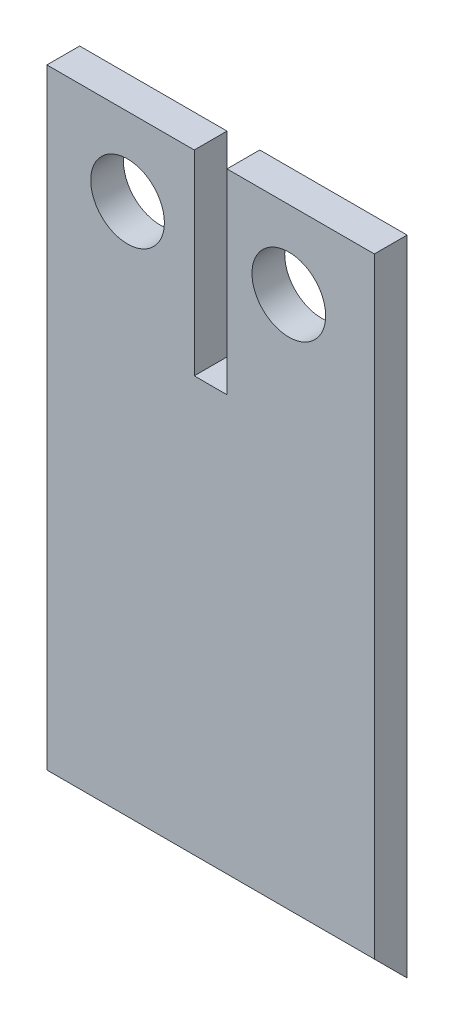
ISO-10303-21;
HEADER;
FILE_DESCRIPTION(('STEP AP214'),'2;1');
FILE_NAME('part.step','',(''),(''),'','','');
FILE_SCHEMA(('AUTOMOTIVE_DESIGN { 1 0 10303 214 1 1 1 1 }'));
ENDSEC;
DATA;
#1=APPLICATION_CONTEXT('core data for automotive mechanical design processes');
#2=APPLICATION_PROTOCOL_DEFINITION('international standard','automotive_design',2000,#1);
#3=PRODUCT_CONTEXT('',#1,'mechanical');
#4=PRODUCT('Part','Part','',(#3));
#5=PRODUCT_RELATED_PRODUCT_CATEGORY('part','',(#4));
#6=PRODUCT_DEFINITION_FORMATION('','',#4);
#7=PRODUCT_DEFINITION_CONTEXT('part definition',#1,'design');
#8=PRODUCT_DEFINITION('design','',#6,#7);
#9=PRODUCT_DEFINITION_SHAPE('','',#8);
#10=(LENGTH_UNIT() NAMED_UNIT(*) SI_UNIT(.MILLI.,.METRE.));
#11=(NAMED_UNIT(*) PLANE_ANGLE_UNIT() SI_UNIT($,.RADIAN.));
#12=(NAMED_UNIT(*) SI_UNIT($,.STERADIAN.) SOLID_ANGLE_UNIT());
#13=UNCERTAINTY_MEASURE_WITH_UNIT(LENGTH_MEASURE(1.E-05),#10,'distance_accuracy_value','');
#14=(GEOMETRIC_REPRESENTATION_CONTEXT(3) GLOBAL_UNCERTAINTY_ASSIGNED_CONTEXT((#13)) GLOBAL_UNIT_ASSIGNED_CONTEXT((#10,
#11,#12)) REPRESENTATION_CONTEXT('',''));
#15=CARTESIAN_POINT('',(0.,0.,0.));
#16=DIRECTION('',(0.,0.,1.));
#17=DIRECTION('',(1.,0.,0.));
#18=AXIS2_PLACEMENT_3D('',#15,#16,#17);
#19=CARTESIAN_POINT('',(1.27451486335826,14.9609502895532,-6.34261418809615));
#20=DIRECTION('',(-1.,0.,0.));
#21=DIRECTION('',(0.,1.,0.));
#22=AXIS2_PLACEMENT_3D('',#19,#20,#21);
#23=PLANE('',#22);
#24=DIRECTION('',(0.,1.,0.));
#25=VECTOR('',#24,1.);
#26=CARTESIAN_POINT('',(1.27451486335826,-90.3427287619298,1.65738581190384));
#27=LINE('',#26,#25);
#28=CARTESIAN_POINT('',(1.27451486335826,3.01245651019011,1.65738581190384));
#29=VERTEX_POINT('',#28);
#30=CARTESIAN_POINT('',(1.27451486335826,14.9609502895532,1.65738581190384));
#31=VERTEX_POINT('',#30);
#32=EDGE_CURVE('E158',#29,#31,#27,.T.);
#33=ORIENTED_EDGE('',*,*,#32,.T.);
#34=DIRECTION('',(0.,0.,1.));
#35=VECTOR('',#34,1.);
#36=CARTESIAN_POINT('',(1.27451486335826,14.9609502895532,-2.44261418809614));
#37=LINE('',#36,#35);
#38=CARTESIAN_POINT('',(1.27451486335826,14.9609502895532,3.65738581190385));
#39=VERTEX_POINT('',#38);
#40=EDGE_CURVE('E41',#31,#39,#37,.T.);
#41=ORIENTED_EDGE('',*,*,#40,.T.);
#42=DIRECTION('',(0.,-1.,0.));
#43=VECTOR('',#42,1.);
#44=CARTESIAN_POINT('',(1.27451486335826,14.9609502895532,3.65738581190385));
#45=LINE('',#44,#43);
#46=CARTESIAN_POINT('',(1.27451486335826,3.01245651019011,3.65738581190385));
#47=VERTEX_POINT('',#46);
#48=EDGE_CURVE('E178',#39,#47,#45,.T.);
#49=ORIENTED_EDGE('',*,*,#48,.T.);
#50=DIRECTION('',(0.,0.,1.));
#51=VECTOR('',#50,1.);
#52=CARTESIAN_POINT('',(1.27451486335826,3.01245651019011,-6.34261418809615));
#53=LINE('',#52,#51);
#54=EDGE_CURVE('E11',#29,#47,#53,.T.);
#55=ORIENTED_EDGE('',*,*,#54,.F.);
#56=EDGE_LOOP('',(#33,#41,#49,#55));
#57=FACE_BOUND('',#56,.T.);
#58=ADVANCED_FACE('F17',(#57),#23,.F.);
#59=CARTESIAN_POINT('',(3.27451486335826,3.01245651019011,-6.34261418809615));
#60=DIRECTION('',(0.,-1.,0.));
#61=DIRECTION('',(0.,0.,-1.));
#62=AXIS2_PLACEMENT_3D('',#59,#60,#61);
#63=PLANE('',#62);
#64=DIRECTION('',(-1.,0.,0.));
#65=VECTOR('',#64,1.);
#66=CARTESIAN_POINT('',(-7.72548513664177,3.01245651019011,1.65738581190384));
#67=LINE('',#66,#65);
#68=CARTESIAN_POINT('',(3.27451486335826,3.01245651019011,1.65738581190384));
#69=VERTEX_POINT('',#68);
#70=EDGE_CURVE('E161',#69,#29,#67,.T.);
#71=ORIENTED_EDGE('',*,*,#70,.T.);
#72=ORIENTED_EDGE('',*,*,#54,.T.);
#73=DIRECTION('',(1.,0.,0.));
#74=VECTOR('',#73,1.);
#75=CARTESIAN_POINT('',(3.27451486335826,3.01245651019011,3.65738581190385));
#76=LINE('',#75,#74);
#77=CARTESIAN_POINT('',(3.27451486335826,3.01245651019011,3.65738581190385));
#78=VERTEX_POINT('',#77);
#79=EDGE_CURVE('E174',#47,#78,#76,.T.);
#80=ORIENTED_EDGE('',*,*,#79,.T.);
#81=DIRECTION('',(0.,0.,1.));
#82=VECTOR('',#81,1.);
#83=CARTESIAN_POINT('',(3.27451486335826,3.01245651019011,-6.34261418809615));
#84=LINE('',#83,#82);
#85=EDGE_CURVE('E21',#69,#78,#84,.T.);
#86=ORIENTED_EDGE('',*,*,#85,.F.);
#87=EDGE_LOOP('',(#71,#72,#80,#86));
#88=FACE_BOUND('',#87,.T.);
#89=ADVANCED_FACE('F235',(#88),#63,.F.);
#90=CARTESIAN_POINT('',(3.27451486335826,14.9609502895532,-6.34261418809615));
#91=DIRECTION('',(1.,0.,0.));
#92=DIRECTION('',(0.,1.,0.));
#93=AXIS2_PLACEMENT_3D('',#90,#91,#92);
#94=PLANE('',#93);
#95=DIRECTION('',(0.,-1.,0.));
#96=VECTOR('',#95,1.);
#97=CARTESIAN_POINT('',(3.27451486335827,-90.3427287619298,1.65738581190384));
#98=LINE('',#97,#96);
#99=CARTESIAN_POINT('',(3.27451486335826,14.9609502895532,1.65738581190384));
#100=VERTEX_POINT('',#99);
#101=EDGE_CURVE('E128',#100,#69,#98,.T.);
#102=ORIENTED_EDGE('',*,*,#101,.T.);
#103=ORIENTED_EDGE('',*,*,#85,.T.);
#104=DIRECTION('',(0.,1.,0.));
#105=VECTOR('',#104,1.);
#106=CARTESIAN_POINT('',(3.27451486335826,14.9609502895532,3.65738581190385));
#107=LINE('',#106,#105);
#108=CARTESIAN_POINT('',(3.27451486335826,14.9609502895532,3.65738581190385));
#109=VERTEX_POINT('',#108);
#110=EDGE_CURVE('E171',#78,#109,#107,.T.);
#111=ORIENTED_EDGE('',*,*,#110,.T.);
#112=DIRECTION('',(0.,0.,-1.));
#113=VECTOR('',#112,1.);
#114=CARTESIAN_POINT('',(3.27451486335826,14.9609502895532,-2.44261418809614));
#115=LINE('',#114,#113);
#116=EDGE_CURVE('E208',#109,#100,#115,.T.);
#117=ORIENTED_EDGE('',*,*,#116,.T.);
#118=EDGE_LOOP('',(#102,#103,#111,#117));
#119=FACE_BOUND('',#118,.T.);
#120=ADVANCED_FACE('F244',(#119),#94,.F.);
#121=CARTESIAN_POINT('',(11.9745148633661,14.9609502895532,-2.44261418809614));
#122=DIRECTION('',(0.,1.,0.));
#123=DIRECTION('',(1.,0.,0.));
#124=AXIS2_PLACEMENT_3D('',#121,#122,#123);
#125=PLANE('',#124);
#126=ORIENTED_EDGE('',*,*,#40,.F.);
#127=DIRECTION('',(-1.,0.,0.));
#128=VECTOR('',#127,1.);
#129=CARTESIAN_POINT('',(12.2745148633584,14.9609502895532,1.65738581190384));
#130=LINE('',#129,#128);
#131=CARTESIAN_POINT('',(-7.72548513664175,14.9609502895531,1.65738581190384));
#132=VERTEX_POINT('',#131);
#133=EDGE_CURVE('E153',#31,#132,#130,.T.);
#134=ORIENTED_EDGE('',*,*,#133,.T.);
#135=DIRECTION('',(0.,0.,1.));
#136=VECTOR('',#135,1.);
#137=CARTESIAN_POINT('',(-7.72548513664175,14.9609502895531,3.65738581190385));
#138=LINE('',#137,#136);
#139=CARTESIAN_POINT('',(-7.72548513664175,14.9609502895532,3.65738581190385));
#140=VERTEX_POINT('',#139);
#141=EDGE_CURVE('E166',#132,#140,#138,.T.);
#142=ORIENTED_EDGE('',*,*,#141,.T.);
#143=DIRECTION('',(1.,0.,0.));
#144=VECTOR('',#143,1.);
#145=CARTESIAN_POINT('',(12.2745148633584,14.9609502895532,3.65738581190385));
#146=LINE('',#145,#144);
#147=EDGE_CURVE('E55',#140,#39,#146,.T.);
#148=ORIENTED_EDGE('',*,*,#147,.T.);
#149=EDGE_LOOP('',(#126,#134,#142,#148));
#150=FACE_BOUND('',#149,.T.);
#151=ADVANCED_FACE('F19',(#150),#125,.T.);
#152=CARTESIAN_POINT('',(-7.72548513664175,-90.3427287619298,3.65738581190385));
#153=DIRECTION('',(0.,0.,1.));
#154=DIRECTION('',(1.,0.,0.));
#155=AXIS2_PLACEMENT_3D('',#152,#153,#154);
#156=PLANE('',#155);
#157=CARTESIAN_POINT('',(-2.80048513663389,10.1998046715531,3.65738581190385));
#158=DIRECTION('',(0.,0.,1.));
#159=DIRECTION('',(1.,0.,0.));
#160=AXIS2_PLACEMENT_3D('',#157,#158,#159);
#161=CIRCLE('',#160,2.24999999996944);
#162=CARTESIAN_POINT('',(-0.55048513666445,10.1998046715531,3.65738581190385));
#163=VERTEX_POINT('',#162);
#164=EDGE_CURVE('E199',#163,#163,#161,.T.);
#165=ORIENTED_EDGE('',*,*,#164,.F.);
#166=EDGE_LOOP('',(#165));
#167=FACE_BOUND('',#166,.T.);
#168=CARTESIAN_POINT('',(7.04951486336611,10.1998046715532,3.65738581190385));
#169=DIRECTION('',(0.,0.,1.));
#170=DIRECTION('',(1.,0.,0.));
#171=AXIS2_PLACEMENT_3D('',#168,#169,#170);
#172=CIRCLE('',#171,2.24999999996944);
#173=CARTESIAN_POINT('',(9.29951486333555,10.1998046715532,3.65738581190385));
#174=VERTEX_POINT('',#173);
#175=EDGE_CURVE('E190',#174,#174,#172,.T.);
#176=ORIENTED_EDGE('',*,*,#175,.F.);
#177=EDGE_LOOP('',(#176));
#178=FACE_BOUND('',#177,.T.);
#179=ORIENTED_EDGE('',*,*,#110,.F.);
#180=ORIENTED_EDGE('',*,*,#79,.F.);
#181=ORIENTED_EDGE('',*,*,#48,.F.);
#182=ORIENTED_EDGE('',*,*,#147,.F.);
#183=DIRECTION('',(0.,1.,0.));
#184=VECTOR('',#183,1.);
#185=CARTESIAN_POINT('',(-7.72548513664175,-90.3427287619298,3.65738581190385));
#186=LINE('',#185,#184);
#187=CARTESIAN_POINT('',(-7.72548513664175,-22.3407287619297,3.65738581190385));
#188=VERTEX_POINT('',#187);
#189=EDGE_CURVE('E162',#188,#140,#186,.T.);
#190=ORIENTED_EDGE('',*,*,#189,.F.);
#191=DIRECTION('',(-1.,0.,0.));
#192=VECTOR('',#191,1.);
#193=CARTESIAN_POINT('',(-7.7254851366419,-22.3407287619298,3.65738581190385));
#194=LINE('',#193,#192);
#195=CARTESIAN_POINT('',(12.2745148633583,-22.3407287619297,3.65738581190385));
#196=VERTEX_POINT('',#195);
#197=EDGE_CURVE('E138',#196,#188,#194,.T.);
#198=ORIENTED_EDGE('',*,*,#197,.F.);
#199=DIRECTION('',(0.,1.,0.));
#200=VECTOR('',#199,1.);
#201=CARTESIAN_POINT('',(12.2745148633583,-90.3427287619298,3.65738581190385));
#202=LINE('',#201,#200);
#203=CARTESIAN_POINT('',(12.2745148633583,14.9609502895532,3.65738581190385));
#204=VERTEX_POINT('',#203);
#205=EDGE_CURVE('E133',#196,#204,#202,.T.);
#206=ORIENTED_EDGE('',*,*,#205,.T.);
#207=DIRECTION('',(1.,0.,0.));
#208=VECTOR('',#207,1.);
#209=CARTESIAN_POINT('',(12.2745148633584,14.9609502895532,3.65738581190385));
#210=LINE('',#209,#208);
#211=EDGE_CURVE('E212',#109,#204,#210,.T.);
#212=ORIENTED_EDGE('',*,*,#211,.F.);
#213=EDGE_LOOP('',(#179,#180,#181,#182,#190,#198,#206,#212));
#214=FACE_BOUND('',#213,.T.);
#215=ADVANCED_FACE('F248',(#167,#178,#214),#156,.T.);
#216=CARTESIAN_POINT('',(12.2745148633583,-90.3427287619298,3.65738581190385));
#217=DIRECTION('',(1.,0.,0.));
#218=DIRECTION('',(0.,1.,0.));
#219=AXIS2_PLACEMENT_3D('',#216,#217,#218);
#220=PLANE('',#219);
#221=DIRECTION('',(0.,0.707106781186548,0.707106781186548));
#222=VECTOR('',#221,1.);
#223=CARTESIAN_POINT('',(12.2745148633583,-56.3417287619298,-30.3436141880962));
#224=LINE('',#223,#222);
#225=CARTESIAN_POINT('',(12.2745148633583,-24.3407287619297,1.65738581190384));
#226=VERTEX_POINT('',#225);
#227=EDGE_CURVE('E131',#226,#196,#224,.T.);
#228=ORIENTED_EDGE('',*,*,#227,.F.);
#229=DIRECTION('',(0.,1.,0.));
#230=VECTOR('',#229,1.);
#231=CARTESIAN_POINT('',(12.2745148633583,-90.3427287619298,1.65738581190384));
#232=LINE('',#231,#230);
#233=CARTESIAN_POINT('',(12.2745148633583,14.9609502895532,1.65738581190384));
#234=VERTEX_POINT('',#233);
#235=EDGE_CURVE('E113',#226,#234,#232,.T.);
#236=ORIENTED_EDGE('',*,*,#235,.T.);
#237=DIRECTION('',(0.,0.,-1.));
#238=VECTOR('',#237,1.);
#239=CARTESIAN_POINT('',(12.2745148633583,14.9609502895532,3.65738581190385));
#240=LINE('',#239,#238);
#241=EDGE_CURVE('E202',#204,#234,#240,.T.);
#242=ORIENTED_EDGE('',*,*,#241,.F.);
#243=ORIENTED_EDGE('',*,*,#205,.F.);
#244=EDGE_LOOP('',(#228,#236,#242,#243));
#245=FACE_BOUND('',#244,.T.);
#246=ADVANCED_FACE('F132',(#245),#220,.T.);
#247=CARTESIAN_POINT('',(-7.72548513664175,-90.3427287619298,3.65738581190385));
#248=DIRECTION('',(-1.,0.,0.));
#249=DIRECTION('',(0.,0.,1.));
#250=AXIS2_PLACEMENT_3D('',#247,#248,#249);
#251=PLANE('',#250);
#252=DIRECTION('',(0.,-0.707106781186548,-0.707106781186548));
#253=VECTOR('',#252,1.);
#254=CARTESIAN_POINT('',(-7.72548513664173,-56.3417287619298,-30.3436141880961));
#255=LINE('',#254,#253);
#256=CARTESIAN_POINT('',(-7.72548513664175,-24.3407287619297,1.65738581190384));
#257=VERTEX_POINT('',#256);
#258=EDGE_CURVE('E142',#188,#257,#255,.T.);
#259=ORIENTED_EDGE('',*,*,#258,.F.);
#260=ORIENTED_EDGE('',*,*,#189,.T.);
#261=ORIENTED_EDGE('',*,*,#141,.F.);
#262=DIRECTION('',(0.,1.,0.));
#263=VECTOR('',#262,1.);
#264=CARTESIAN_POINT('',(-7.72548513664175,-90.3427287619298,1.65738581190384));
#265=LINE('',#264,#263);
#266=EDGE_CURVE('E127',#257,#132,#265,.T.);
#267=ORIENTED_EDGE('',*,*,#266,.F.);
#268=EDGE_LOOP('',(#259,#260,#261,#267));
#269=FACE_BOUND('',#268,.T.);
#270=ADVANCED_FACE('F262',(#269),#251,.T.);
#271=CARTESIAN_POINT('',(-7.72548513664175,-90.3427287619298,1.65738581190384));
#272=DIRECTION('',(0.,0.,-1.));
#273=DIRECTION('',(0.,-1.,0.));
#274=AXIS2_PLACEMENT_3D('',#271,#272,#273);
#275=PLANE('',#274);
#276=CARTESIAN_POINT('',(-2.80048513663389,10.1998046715531,1.65738581190384));
#277=DIRECTION('',(0.,0.,-1.));
#278=DIRECTION('',(-1.,0.,0.));
#279=AXIS2_PLACEMENT_3D('',#276,#277,#278);
#280=CIRCLE('',#279,2.24999999996944);
#281=CARTESIAN_POINT('',(-5.05048513660333,10.1998046715531,1.65738581190384));
#282=VERTEX_POINT('',#281);
#283=EDGE_CURVE('E194',#282,#282,#280,.T.);
#284=ORIENTED_EDGE('',*,*,#283,.F.);
#285=EDGE_LOOP('',(#284));
#286=FACE_BOUND('',#285,.T.);
#287=CARTESIAN_POINT('',(7.04951486336611,10.1998046715532,1.65738581190384));
#288=DIRECTION('',(0.,0.,-1.));
#289=DIRECTION('',(-1.,0.,0.));
#290=AXIS2_PLACEMENT_3D('',#287,#288,#289);
#291=CIRCLE('',#290,2.24999999996944);
#292=CARTESIAN_POINT('',(4.79951486339667,10.1998046715532,1.65738581190384));
#293=VERTEX_POINT('',#292);
#294=EDGE_CURVE('E195',#293,#293,#291,.T.);
#295=ORIENTED_EDGE('',*,*,#294,.F.);
#296=EDGE_LOOP('',(#295));
#297=FACE_BOUND('',#296,.T.);
#298=ORIENTED_EDGE('',*,*,#101,.F.);
#299=DIRECTION('',(-1.,0.,0.));
#300=VECTOR('',#299,1.);
#301=CARTESIAN_POINT('',(12.2745148633584,14.9609502895532,1.65738581190384));
#302=LINE('',#301,#300);
#303=EDGE_CURVE('E122',#234,#100,#302,.T.);
#304=ORIENTED_EDGE('',*,*,#303,.F.);
#305=ORIENTED_EDGE('',*,*,#235,.F.);
#306=DIRECTION('',(1.,0.,0.));
#307=VECTOR('',#306,1.);
#308=CARTESIAN_POINT('',(-7.72548513664189,-24.3407287619298,1.65738581190384));
#309=LINE('',#308,#307);
#310=EDGE_CURVE('E119',#257,#226,#309,.T.);
#311=ORIENTED_EDGE('',*,*,#310,.F.);
#312=ORIENTED_EDGE('',*,*,#266,.T.);
#313=ORIENTED_EDGE('',*,*,#133,.F.);
#314=ORIENTED_EDGE('',*,*,#32,.F.);
#315=ORIENTED_EDGE('',*,*,#70,.F.);
#316=EDGE_LOOP('',(#298,#304,#305,#311,#312,#313,#314,#315));
#317=FACE_BOUND('',#316,.T.);
#318=ADVANCED_FACE('F116',(#286,#297,#317),#275,.T.);
#319=CARTESIAN_POINT('',(33.9402179409666,46.3917273784212,72.3898419522548));
#320=DIRECTION('',(0.,0.707106781186548,-0.707106781186548));
#321=DIRECTION('',(-1.,0.,0.));
#322=AXIS2_PLACEMENT_3D('',#319,#320,#321);
#323=PLANE('',#322);
#324=ORIENTED_EDGE('',*,*,#258,.T.);
#325=ORIENTED_EDGE('',*,*,#310,.T.);
#326=ORIENTED_EDGE('',*,*,#227,.T.);
#327=ORIENTED_EDGE('',*,*,#197,.T.);
#328=EDGE_LOOP('',(#324,#325,#326,#327));
#329=FACE_BOUND('',#328,.T.);
#330=ADVANCED_FACE('F140',(#329),#323,.F.);
#331=CARTESIAN_POINT('',(11.9745148633661,14.9609502895532,-2.44261418809614));
#332=DIRECTION('',(0.,1.,0.));
#333=DIRECTION('',(1.,0.,0.));
#334=AXIS2_PLACEMENT_3D('',#331,#332,#333);
#335=PLANE('',#334);
#336=ORIENTED_EDGE('',*,*,#116,.F.);
#337=ORIENTED_EDGE('',*,*,#211,.T.);
#338=ORIENTED_EDGE('',*,*,#241,.T.);
#339=ORIENTED_EDGE('',*,*,#303,.T.);
#340=EDGE_LOOP('',(#336,#337,#338,#339));
#341=FACE_BOUND('',#340,.T.);
#342=ADVANCED_FACE('F255',(#341),#335,.T.);
#343=CARTESIAN_POINT('',(-2.80048513663389,10.1998046715531,-6.34261418809615));
#344=DIRECTION('',(0.,0.,1.));
#345=DIRECTION('',(1.,0.,0.));
#346=AXIS2_PLACEMENT_3D('',#343,#344,#345);
#347=CYLINDRICAL_SURFACE('',#346,2.24999999996944);
#348=ORIENTED_EDGE('',*,*,#164,.T.);
#349=EDGE_LOOP('',(#348));
#350=FACE_BOUND('',#349,.T.);
#351=ORIENTED_EDGE('',*,*,#283,.T.);
#352=EDGE_LOOP('',(#351));
#353=FACE_BOUND('',#352,.T.);
#354=ADVANCED_FACE('F252',(#350,#353),#347,.F.);
#355=CARTESIAN_POINT('',(7.04951486336611,10.1998046715532,-6.34261418809615));
#356=DIRECTION('',(0.,0.,1.));
#357=DIRECTION('',(1.,0.,0.));
#358=AXIS2_PLACEMENT_3D('',#355,#356,#357);
#359=CYLINDRICAL_SURFACE('',#358,2.24999999996944);
#360=ORIENTED_EDGE('',*,*,#175,.T.);
#361=EDGE_LOOP('',(#360));
#362=FACE_BOUND('',#361,.T.);
#363=ORIENTED_EDGE('',*,*,#294,.T.);
#364=EDGE_LOOP('',(#363));
#365=FACE_BOUND('',#364,.T.);
#366=ADVANCED_FACE('F247',(#362,#365),#359,.F.);
#367=CLOSED_SHELL('',(#58,#89,#120,#151,#215,#246,#270,#318,#330,#342,#354,#366));
#368=MANIFOLD_SOLID_BREP('B1',#367);
#369=ADVANCED_BREP_SHAPE_REPRESENTATION('',(#18,#368),#14);
#370=SHAPE_DEFINITION_REPRESENTATION(#9,#369);
ENDSEC;
END-ISO-10303-21;
